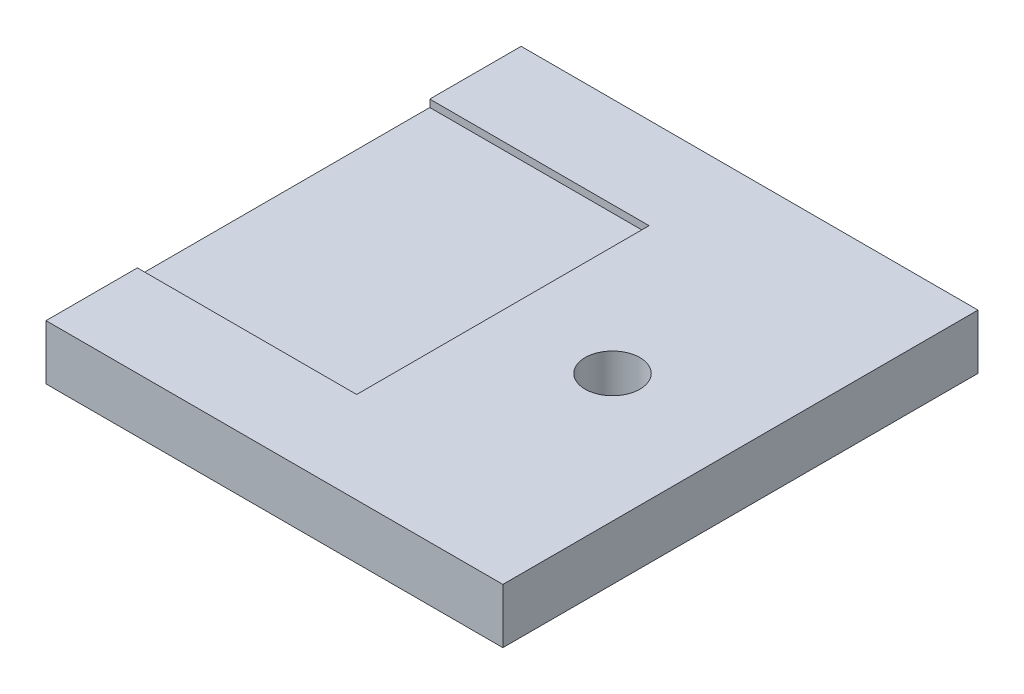
ISO-10303-21;
HEADER;
FILE_DESCRIPTION(('STEP AP214'),'2;1');
FILE_NAME('part.step','',(''),(''),'','','');
FILE_SCHEMA(('AUTOMOTIVE_DESIGN { 1 0 10303 214 1 1 1 1 }'));
ENDSEC;
DATA;
#1=APPLICATION_CONTEXT('core data for automotive mechanical design processes');
#2=APPLICATION_PROTOCOL_DEFINITION('international standard','automotive_design',2000,#1);
#3=PRODUCT_CONTEXT('',#1,'mechanical');
#4=PRODUCT('Part','Part','',(#3));
#5=PRODUCT_RELATED_PRODUCT_CATEGORY('part','',(#4));
#6=PRODUCT_DEFINITION_FORMATION('','',#4);
#7=PRODUCT_DEFINITION_CONTEXT('part definition',#1,'design');
#8=PRODUCT_DEFINITION('design','',#6,#7);
#9=PRODUCT_DEFINITION_SHAPE('','',#8);
#10=(LENGTH_UNIT() NAMED_UNIT(*) SI_UNIT(.MILLI.,.METRE.));
#11=(NAMED_UNIT(*) PLANE_ANGLE_UNIT() SI_UNIT($,.RADIAN.));
#12=(NAMED_UNIT(*) SI_UNIT($,.STERADIAN.) SOLID_ANGLE_UNIT());
#13=UNCERTAINTY_MEASURE_WITH_UNIT(LENGTH_MEASURE(1.E-05),#10,'distance_accuracy_value','');
#14=(GEOMETRIC_REPRESENTATION_CONTEXT(3) GLOBAL_UNCERTAINTY_ASSIGNED_CONTEXT((#13)) GLOBAL_UNIT_ASSIGNED_CONTEXT((#10,
#11,#12)) REPRESENTATION_CONTEXT('',''));
#15=CARTESIAN_POINT('',(0.,0.,0.));
#16=DIRECTION('',(0.,0.,1.));
#17=DIRECTION('',(1.,0.,0.));
#18=AXIS2_PLACEMENT_3D('',#15,#16,#17);
#19=CARTESIAN_POINT('',(0.,3.,0.));
#20=DIRECTION('',(0.,-1.,0.));
#21=DIRECTION('',(0.,0.,-1.));
#22=AXIS2_PLACEMENT_3D('',#19,#20,#21);
#23=PLANE('',#22);
#24=DIRECTION('',(0.,0.,1.));
#25=VECTOR('',#24,1.);
#26=CARTESIAN_POINT('',(0.,3.,0.));
#27=LINE('',#26,#25);
#28=CARTESIAN_POINT('',(0.,3.,-26.));
#29=VERTEX_POINT('',#28);
#30=CARTESIAN_POINT('',(0.,3.,-21.));
#31=VERTEX_POINT('',#30);
#32=EDGE_CURVE('E146',#29,#31,#27,.T.);
#33=ORIENTED_EDGE('',*,*,#32,.T.);
#34=DIRECTION('',(-1.,0.,0.));
#35=VECTOR('',#34,1.);
#36=CARTESIAN_POINT('',(0.,3.,-21.));
#37=LINE('',#36,#35);
#38=CARTESIAN_POINT('',(12.,3.,-21.));
#39=VERTEX_POINT('',#38);
#40=EDGE_CURVE('E129',#39,#31,#37,.T.);
#41=ORIENTED_EDGE('',*,*,#40,.F.);
#42=DIRECTION('',(0.,0.,-1.));
#43=VECTOR('',#42,1.);
#44=CARTESIAN_POINT('',(12.,3.,-21.));
#45=LINE('',#44,#43);
#46=CARTESIAN_POINT('',(12.,3.,-5.));
#47=VERTEX_POINT('',#46);
#48=EDGE_CURVE('E274',#47,#39,#45,.T.);
#49=ORIENTED_EDGE('',*,*,#48,.F.);
#50=DIRECTION('',(1.,0.,0.));
#51=VECTOR('',#50,1.);
#52=CARTESIAN_POINT('',(0.,3.,-5.));
#53=LINE('',#52,#51);
#54=CARTESIAN_POINT('',(0.,3.,-5.));
#55=VERTEX_POINT('',#54);
#56=EDGE_CURVE('E279',#55,#47,#53,.T.);
#57=ORIENTED_EDGE('',*,*,#56,.F.);
#58=CARTESIAN_POINT('',(0.,3.,0.));
#59=VERTEX_POINT('',#58);
#60=EDGE_CURVE('E91',#55,#59,#27,.T.);
#61=ORIENTED_EDGE('',*,*,#60,.T.);
#62=DIRECTION('',(1.,0.,0.));
#63=VECTOR('',#62,1.);
#64=CARTESIAN_POINT('',(0.,3.,0.));
#65=LINE('',#64,#63);
#66=CARTESIAN_POINT('',(25.,3.,0.));
#67=VERTEX_POINT('',#66);
#68=EDGE_CURVE('E148',#59,#67,#65,.T.);
#69=ORIENTED_EDGE('',*,*,#68,.T.);
#70=DIRECTION('',(0.,0.,-1.));
#71=VECTOR('',#70,1.);
#72=CARTESIAN_POINT('',(25.,3.,0.));
#73=LINE('',#72,#71);
#74=CARTESIAN_POINT('',(25.,3.,-26.));
#75=VERTEX_POINT('',#74);
#76=EDGE_CURVE('E150',#67,#75,#73,.T.);
#77=ORIENTED_EDGE('',*,*,#76,.T.);
#78=DIRECTION('',(-1.,0.,0.));
#79=VECTOR('',#78,1.);
#80=CARTESIAN_POINT('',(0.,3.,-26.));
#81=LINE('',#80,#79);
#82=EDGE_CURVE('E63',#75,#29,#81,.T.);
#83=ORIENTED_EDGE('',*,*,#82,.T.);
#84=EDGE_LOOP('',(#33,#41,#49,#57,#61,#69,#77,#83));
#85=FACE_BOUND('',#84,.T.);
#86=CARTESIAN_POINT('',(18.,3.,-13.));
#87=DIRECTION('',(0.,1.,0.));
#88=DIRECTION('',(0.,0.,1.));
#89=AXIS2_PLACEMENT_3D('',#86,#87,#88);
#90=CIRCLE('',#89,1.5);
#91=CARTESIAN_POINT('',(18.,3.,-11.5));
#92=VERTEX_POINT('',#91);
#93=EDGE_CURVE('E138',#92,#92,#90,.T.);
#94=ORIENTED_EDGE('',*,*,#93,.F.);
#95=EDGE_LOOP('',(#94));
#96=FACE_BOUND('',#95,.T.);
#97=ADVANCED_FACE('F39',(#85,#96),#23,.F.);
#98=CARTESIAN_POINT('',(0.,0.,0.));
#99=DIRECTION('',(0.,-1.,0.));
#100=DIRECTION('',(0.,0.,-1.));
#101=AXIS2_PLACEMENT_3D('',#98,#99,#100);
#102=PLANE('',#101);
#103=DIRECTION('',(0.,0.,1.));
#104=VECTOR('',#103,1.);
#105=CARTESIAN_POINT('',(0.,0.,0.));
#106=LINE('',#105,#104);
#107=CARTESIAN_POINT('',(0.,0.,-26.));
#108=VERTEX_POINT('',#107);
#109=CARTESIAN_POINT('',(0.,0.,0.));
#110=VERTEX_POINT('',#109);
#111=EDGE_CURVE('E141',#108,#110,#106,.T.);
#112=ORIENTED_EDGE('',*,*,#111,.F.);
#113=DIRECTION('',(-1.,0.,0.));
#114=VECTOR('',#113,1.);
#115=CARTESIAN_POINT('',(0.,0.,-26.));
#116=LINE('',#115,#114);
#117=CARTESIAN_POINT('',(25.,0.,-26.));
#118=VERTEX_POINT('',#117);
#119=EDGE_CURVE('E84',#118,#108,#116,.T.);
#120=ORIENTED_EDGE('',*,*,#119,.F.);
#121=DIRECTION('',(0.,0.,-1.));
#122=VECTOR('',#121,1.);
#123=CARTESIAN_POINT('',(25.,0.,0.));
#124=LINE('',#123,#122);
#125=CARTESIAN_POINT('',(25.,0.,0.));
#126=VERTEX_POINT('',#125);
#127=EDGE_CURVE('E158',#126,#118,#124,.T.);
#128=ORIENTED_EDGE('',*,*,#127,.F.);
#129=DIRECTION('',(1.,0.,0.));
#130=VECTOR('',#129,1.);
#131=CARTESIAN_POINT('',(0.,0.,0.));
#132=LINE('',#131,#130);
#133=EDGE_CURVE('E156',#110,#126,#132,.T.);
#134=ORIENTED_EDGE('',*,*,#133,.F.);
#135=EDGE_LOOP('',(#112,#120,#128,#134));
#136=FACE_BOUND('',#135,.T.);
#137=CARTESIAN_POINT('',(18.,0.,-13.));
#138=DIRECTION('',(0.,1.,0.));
#139=DIRECTION('',(0.,0.,1.));
#140=AXIS2_PLACEMENT_3D('',#137,#138,#139);
#141=CIRCLE('',#140,1.5);
#142=CARTESIAN_POINT('',(18.,0.,-11.5));
#143=VERTEX_POINT('',#142);
#144=EDGE_CURVE('E142',#143,#143,#141,.T.);
#145=ORIENTED_EDGE('',*,*,#144,.T.);
#146=EDGE_LOOP('',(#145));
#147=FACE_BOUND('',#146,.T.);
#148=ADVANCED_FACE('F173',(#136,#147),#102,.T.);
#149=CARTESIAN_POINT('',(0.,3.,0.));
#150=DIRECTION('',(1.,0.,0.));
#151=DIRECTION('',(0.,0.,-1.));
#152=AXIS2_PLACEMENT_3D('',#149,#150,#151);
#153=PLANE('',#152);
#154=DIRECTION('',(0.,0.,1.));
#155=VECTOR('',#154,1.);
#156=CARTESIAN_POINT('',(0.,2.6,-21.));
#157=LINE('',#156,#155);
#158=CARTESIAN_POINT('',(0.,2.6,-21.));
#159=VERTEX_POINT('',#158);
#160=CARTESIAN_POINT('',(0.,2.6,-5.));
#161=VERTEX_POINT('',#160);
#162=EDGE_CURVE('E123',#159,#161,#157,.T.);
#163=ORIENTED_EDGE('',*,*,#162,.F.);
#164=DIRECTION('',(0.,1.,0.));
#165=VECTOR('',#164,1.);
#166=CARTESIAN_POINT('',(0.,2.6,-21.));
#167=LINE('',#166,#165);
#168=EDGE_CURVE('E145',#159,#31,#167,.T.);
#169=ORIENTED_EDGE('',*,*,#168,.T.);
#170=ORIENTED_EDGE('',*,*,#32,.F.);
#171=DIRECTION('',(0.,-1.,0.));
#172=VECTOR('',#171,1.);
#173=CARTESIAN_POINT('',(0.,3.,-26.));
#174=LINE('',#173,#172);
#175=EDGE_CURVE('E153',#29,#108,#174,.T.);
#176=ORIENTED_EDGE('',*,*,#175,.T.);
#177=ORIENTED_EDGE('',*,*,#111,.T.);
#178=DIRECTION('',(0.,-1.,0.));
#179=VECTOR('',#178,1.);
#180=CARTESIAN_POINT('',(0.,3.,0.));
#181=LINE('',#180,#179);
#182=EDGE_CURVE('E11',#59,#110,#181,.T.);
#183=ORIENTED_EDGE('',*,*,#182,.F.);
#184=ORIENTED_EDGE('',*,*,#60,.F.);
#185=DIRECTION('',(0.,1.,0.));
#186=VECTOR('',#185,1.);
#187=CARTESIAN_POINT('',(0.,2.6,-5.));
#188=LINE('',#187,#186);
#189=EDGE_CURVE('E119',#161,#55,#188,.T.);
#190=ORIENTED_EDGE('',*,*,#189,.F.);
#191=EDGE_LOOP('',(#163,#169,#170,#176,#177,#183,#184,#190));
#192=FACE_BOUND('',#191,.T.);
#193=ADVANCED_FACE('F41',(#192),#153,.F.);
#194=CARTESIAN_POINT('',(0.,3.,0.));
#195=DIRECTION('',(0.,0.,-1.));
#196=DIRECTION('',(-1.,0.,0.));
#197=AXIS2_PLACEMENT_3D('',#194,#195,#196);
#198=PLANE('',#197);
#199=ORIENTED_EDGE('',*,*,#133,.T.);
#200=DIRECTION('',(0.,-1.,0.));
#201=VECTOR('',#200,1.);
#202=CARTESIAN_POINT('',(25.,3.,0.));
#203=LINE('',#202,#201);
#204=EDGE_CURVE('E47',#67,#126,#203,.T.);
#205=ORIENTED_EDGE('',*,*,#204,.F.);
#206=ORIENTED_EDGE('',*,*,#68,.F.);
#207=ORIENTED_EDGE('',*,*,#182,.T.);
#208=EDGE_LOOP('',(#199,#205,#206,#207));
#209=FACE_BOUND('',#208,.T.);
#210=ADVANCED_FACE('F187',(#209),#198,.F.);
#211=CARTESIAN_POINT('',(25.,3.,0.));
#212=DIRECTION('',(-1.,0.,0.));
#213=DIRECTION('',(0.,0.,1.));
#214=AXIS2_PLACEMENT_3D('',#211,#212,#213);
#215=PLANE('',#214);
#216=ORIENTED_EDGE('',*,*,#127,.T.);
#217=DIRECTION('',(0.,-1.,0.));
#218=VECTOR('',#217,1.);
#219=CARTESIAN_POINT('',(25.,3.,-26.));
#220=LINE('',#219,#218);
#221=EDGE_CURVE('E162',#75,#118,#220,.T.);
#222=ORIENTED_EDGE('',*,*,#221,.F.);
#223=ORIENTED_EDGE('',*,*,#76,.F.);
#224=ORIENTED_EDGE('',*,*,#204,.T.);
#225=EDGE_LOOP('',(#216,#222,#223,#224));
#226=FACE_BOUND('',#225,.T.);
#227=ADVANCED_FACE('F168',(#226),#215,.F.);
#228=CARTESIAN_POINT('',(0.,3.,-26.));
#229=DIRECTION('',(0.,0.,1.));
#230=DIRECTION('',(1.,0.,0.));
#231=AXIS2_PLACEMENT_3D('',#228,#229,#230);
#232=PLANE('',#231);
#233=ORIENTED_EDGE('',*,*,#119,.T.);
#234=ORIENTED_EDGE('',*,*,#175,.F.);
#235=ORIENTED_EDGE('',*,*,#82,.F.);
#236=ORIENTED_EDGE('',*,*,#221,.T.);
#237=EDGE_LOOP('',(#233,#234,#235,#236));
#238=FACE_BOUND('',#237,.T.);
#239=ADVANCED_FACE('F176',(#238),#232,.F.);
#240=CARTESIAN_POINT('',(18.,3.,-13.));
#241=DIRECTION('',(0.,-1.,0.));
#242=DIRECTION('',(0.,0.,-1.));
#243=AXIS2_PLACEMENT_3D('',#240,#241,#242);
#244=CYLINDRICAL_SURFACE('',#243,1.5);
#245=ORIENTED_EDGE('',*,*,#93,.T.);
#246=EDGE_LOOP('',(#245));
#247=FACE_BOUND('',#246,.T.);
#248=ORIENTED_EDGE('',*,*,#144,.F.);
#249=EDGE_LOOP('',(#248));
#250=FACE_BOUND('',#249,.T.);
#251=ADVANCED_FACE('F178',(#247,#250),#244,.F.);
#252=CARTESIAN_POINT('',(0.,2.6,-21.));
#253=DIRECTION('',(0.,0.,-1.));
#254=DIRECTION('',(-1.,0.,0.));
#255=AXIS2_PLACEMENT_3D('',#252,#253,#254);
#256=PLANE('',#255);
#257=ORIENTED_EDGE('',*,*,#40,.T.);
#258=ORIENTED_EDGE('',*,*,#168,.F.);
#259=DIRECTION('',(-1.,0.,0.));
#260=VECTOR('',#259,1.);
#261=CARTESIAN_POINT('',(0.,2.6,-21.));
#262=LINE('',#261,#260);
#263=CARTESIAN_POINT('',(12.,2.6,-21.));
#264=VERTEX_POINT('',#263);
#265=EDGE_CURVE('E54',#264,#159,#262,.T.);
#266=ORIENTED_EDGE('',*,*,#265,.F.);
#267=DIRECTION('',(0.,1.,0.));
#268=VECTOR('',#267,1.);
#269=CARTESIAN_POINT('',(12.,2.6,-21.));
#270=LINE('',#269,#268);
#271=EDGE_CURVE('E133',#264,#39,#270,.T.);
#272=ORIENTED_EDGE('',*,*,#271,.T.);
#273=EDGE_LOOP('',(#257,#258,#266,#272));
#274=FACE_BOUND('',#273,.T.);
#275=ADVANCED_FACE('F184',(#274),#256,.F.);
#276=CARTESIAN_POINT('',(12.,2.6,-21.));
#277=DIRECTION('',(1.,0.,0.));
#278=DIRECTION('',(0.,0.,-1.));
#279=AXIS2_PLACEMENT_3D('',#276,#277,#278);
#280=PLANE('',#279);
#281=ORIENTED_EDGE('',*,*,#48,.T.);
#282=ORIENTED_EDGE('',*,*,#271,.F.);
#283=DIRECTION('',(0.,0.,-1.));
#284=VECTOR('',#283,1.);
#285=CARTESIAN_POINT('',(12.,2.6,-21.));
#286=LINE('',#285,#284);
#287=CARTESIAN_POINT('',(12.,2.6,-5.));
#288=VERTEX_POINT('',#287);
#289=EDGE_CURVE('E122',#288,#264,#286,.T.);
#290=ORIENTED_EDGE('',*,*,#289,.F.);
#291=DIRECTION('',(0.,1.,0.));
#292=VECTOR('',#291,1.);
#293=CARTESIAN_POINT('',(12.,2.6,-5.));
#294=LINE('',#293,#292);
#295=EDGE_CURVE('E120',#288,#47,#294,.T.);
#296=ORIENTED_EDGE('',*,*,#295,.T.);
#297=EDGE_LOOP('',(#281,#282,#290,#296));
#298=FACE_BOUND('',#297,.T.);
#299=ADVANCED_FACE('F199',(#298),#280,.F.);
#300=CARTESIAN_POINT('',(0.,2.6,-5.));
#301=DIRECTION('',(0.,0.,1.));
#302=DIRECTION('',(1.,0.,0.));
#303=AXIS2_PLACEMENT_3D('',#300,#301,#302);
#304=PLANE('',#303);
#305=ORIENTED_EDGE('',*,*,#56,.T.);
#306=ORIENTED_EDGE('',*,*,#295,.F.);
#307=DIRECTION('',(1.,0.,0.));
#308=VECTOR('',#307,1.);
#309=CARTESIAN_POINT('',(0.,2.6,-5.));
#310=LINE('',#309,#308);
#311=EDGE_CURVE('E115',#161,#288,#310,.T.);
#312=ORIENTED_EDGE('',*,*,#311,.F.);
#313=ORIENTED_EDGE('',*,*,#189,.T.);
#314=EDGE_LOOP('',(#305,#306,#312,#313));
#315=FACE_BOUND('',#314,.T.);
#316=ADVANCED_FACE('F117',(#315),#304,.F.);
#317=CARTESIAN_POINT('',(0.,2.6,0.));
#318=DIRECTION('',(0.,1.,0.));
#319=DIRECTION('',(0.,0.,1.));
#320=AXIS2_PLACEMENT_3D('',#317,#318,#319);
#321=PLANE('',#320);
#322=ORIENTED_EDGE('',*,*,#162,.T.);
#323=ORIENTED_EDGE('',*,*,#311,.T.);
#324=ORIENTED_EDGE('',*,*,#289,.T.);
#325=ORIENTED_EDGE('',*,*,#265,.T.);
#326=EDGE_LOOP('',(#322,#323,#324,#325));
#327=FACE_BOUND('',#326,.T.);
#328=ADVANCED_FACE('F126',(#327),#321,.T.);
#329=CLOSED_SHELL('',(#97,#148,#193,#210,#227,#239,#251,#275,#299,#316,#328));
#330=MANIFOLD_SOLID_BREP('B2',#329);
#331=ADVANCED_BREP_SHAPE_REPRESENTATION('',(#18,#330),#14);
#332=SHAPE_DEFINITION_REPRESENTATION(#9,#331);
ENDSEC;
END-ISO-10303-21;
